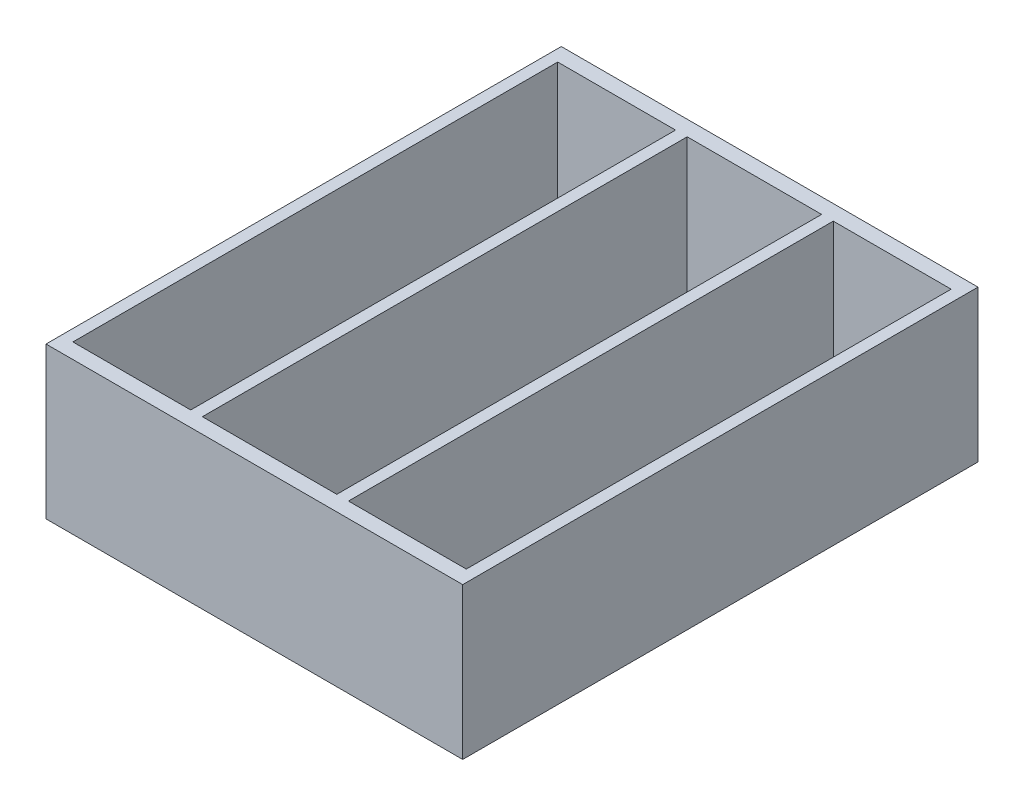
ISO-10303-21;
HEADER;
FILE_DESCRIPTION(('STEP AP214'),'2;1');
FILE_NAME('part.step','',(''),(''),'','','');
FILE_SCHEMA(('AUTOMOTIVE_DESIGN { 1 0 10303 214 1 1 1 1 }'));
ENDSEC;
DATA;
#1=APPLICATION_CONTEXT('core data for automotive mechanical design processes');
#2=APPLICATION_PROTOCOL_DEFINITION('international standard','automotive_design',2000,#1);
#3=PRODUCT_CONTEXT('',#1,'mechanical');
#4=PRODUCT('Part','Part','',(#3));
#5=PRODUCT_RELATED_PRODUCT_CATEGORY('part','',(#4));
#6=PRODUCT_DEFINITION_FORMATION('','',#4);
#7=PRODUCT_DEFINITION_CONTEXT('part definition',#1,'design');
#8=PRODUCT_DEFINITION('design','',#6,#7);
#9=PRODUCT_DEFINITION_SHAPE('','',#8);
#10=(LENGTH_UNIT() NAMED_UNIT(*) SI_UNIT(.MILLI.,.METRE.));
#11=(NAMED_UNIT(*) PLANE_ANGLE_UNIT() SI_UNIT($,.RADIAN.));
#12=(NAMED_UNIT(*) SI_UNIT($,.STERADIAN.) SOLID_ANGLE_UNIT());
#13=UNCERTAINTY_MEASURE_WITH_UNIT(LENGTH_MEASURE(1.E-05),#10,'distance_accuracy_value','');
#14=(GEOMETRIC_REPRESENTATION_CONTEXT(3) GLOBAL_UNCERTAINTY_ASSIGNED_CONTEXT((#13)) GLOBAL_UNIT_ASSIGNED_CONTEXT((#10,
#11,#12)) REPRESENTATION_CONTEXT('',''));
#15=CARTESIAN_POINT('',(0.,0.,0.));
#16=DIRECTION('',(0.,0.,1.));
#17=DIRECTION('',(1.,0.,0.));
#18=AXIS2_PLACEMENT_3D('',#15,#16,#17);
#19=CARTESIAN_POINT('',(-15.1,16.9,0.));
#20=DIRECTION('',(0.,-1.,0.));
#21=DIRECTION('',(0.,0.,-1.));
#22=AXIS2_PLACEMENT_3D('',#19,#20,#21);
#23=CYLINDRICAL_SURFACE('',#22,1.5);
#24=CARTESIAN_POINT('',(-15.1,0.,0.));
#25=DIRECTION('',(0.,-1.,0.));
#26=DIRECTION('',(0.,0.,-1.));
#27=AXIS2_PLACEMENT_3D('',#24,#25,#26);
#28=CIRCLE('',#27,1.5);
#29=CARTESIAN_POINT('',(-15.1,0.,-1.5));
#30=VERTEX_POINT('',#29);
#31=EDGE_CURVE('E290',#30,#30,#28,.T.);
#32=ORIENTED_EDGE('',*,*,#31,.T.);
#33=EDGE_LOOP('',(#32));
#34=FACE_BOUND('',#33,.T.);
#35=CARTESIAN_POINT('',(-15.1,0.799999999999999,0.));
#36=DIRECTION('',(0.,1.,0.));
#37=DIRECTION('',(0.,0.,1.));
#38=AXIS2_PLACEMENT_3D('',#35,#36,#37);
#39=CIRCLE('',#38,1.5);
#40=CARTESIAN_POINT('',(-15.1,0.799999999999999,1.5));
#41=VERTEX_POINT('',#40);
#42=EDGE_CURVE('E43',#41,#41,#39,.F.);
#43=ORIENTED_EDGE('',*,*,#42,.F.);
#44=EDGE_LOOP('',(#43));
#45=FACE_BOUND('',#44,.T.);
#46=ADVANCED_FACE('F39',(#34,#45),#23,.F.);
#47=CARTESIAN_POINT('',(15.1,16.9,0.));
#48=DIRECTION('',(0.,-1.,0.));
#49=DIRECTION('',(0.,0.,-1.));
#50=AXIS2_PLACEMENT_3D('',#47,#48,#49);
#51=CYLINDRICAL_SURFACE('',#50,1.5);
#52=CARTESIAN_POINT('',(15.1,0.,0.));
#53=DIRECTION('',(0.,-1.,0.));
#54=DIRECTION('',(0.,0.,-1.));
#55=AXIS2_PLACEMENT_3D('',#52,#53,#54);
#56=CIRCLE('',#55,1.5);
#57=CARTESIAN_POINT('',(15.1,0.,-1.5));
#58=VERTEX_POINT('',#57);
#59=EDGE_CURVE('E222',#58,#58,#56,.T.);
#60=ORIENTED_EDGE('',*,*,#59,.T.);
#61=EDGE_LOOP('',(#60));
#62=FACE_BOUND('',#61,.T.);
#63=CARTESIAN_POINT('',(15.1,0.799999999999999,0.));
#64=DIRECTION('',(0.,1.,0.));
#65=DIRECTION('',(0.,0.,1.));
#66=AXIS2_PLACEMENT_3D('',#63,#64,#65);
#67=CIRCLE('',#66,1.5);
#68=CARTESIAN_POINT('',(15.1,0.799999999999999,1.5));
#69=VERTEX_POINT('',#68);
#70=EDGE_CURVE('E284',#69,#69,#67,.F.);
#71=ORIENTED_EDGE('',*,*,#70,.F.);
#72=EDGE_LOOP('',(#71));
#73=FACE_BOUND('',#72,.T.);
#74=ADVANCED_FACE('F365',(#62,#73),#51,.F.);
#75=CARTESIAN_POINT('',(-23.25,1.6,28.75));
#76=DIRECTION('',(0.,0.,-1.));
#77=DIRECTION('',(-1.,0.,0.));
#78=AXIS2_PLACEMENT_3D('',#75,#76,#77);
#79=PLANE('',#78);
#80=DIRECTION('',(1.,0.,0.));
#81=VECTOR('',#80,1.);
#82=CARTESIAN_POINT('',(-23.25,0.,28.75));
#83=LINE('',#82,#81);
#84=CARTESIAN_POINT('',(-23.25,0.,28.75));
#85=VERTEX_POINT('',#84);
#86=CARTESIAN_POINT('',(23.25,0.,28.75));
#87=VERTEX_POINT('',#86);
#88=EDGE_CURVE('E257',#85,#87,#83,.T.);
#89=ORIENTED_EDGE('',*,*,#88,.T.);
#90=DIRECTION('',(0.,-1.,0.));
#91=VECTOR('',#90,1.);
#92=CARTESIAN_POINT('',(23.25,1.6,28.75));
#93=LINE('',#92,#91);
#94=CARTESIAN_POINT('',(23.25,16.9,28.75));
#95=VERTEX_POINT('',#94);
#96=EDGE_CURVE('E11',#95,#87,#93,.T.);
#97=ORIENTED_EDGE('',*,*,#96,.F.);
#98=DIRECTION('',(1.,0.,0.));
#99=VECTOR('',#98,1.);
#100=CARTESIAN_POINT('',(0.,16.9,28.75));
#101=LINE('',#100,#99);
#102=CARTESIAN_POINT('',(-23.25,16.9,28.75));
#103=VERTEX_POINT('',#102);
#104=EDGE_CURVE('E186',#103,#95,#101,.T.);
#105=ORIENTED_EDGE('',*,*,#104,.F.);
#106=DIRECTION('',(0.,-1.,0.));
#107=VECTOR('',#106,1.);
#108=CARTESIAN_POINT('',(-23.25,1.6,28.75));
#109=LINE('',#108,#107);
#110=EDGE_CURVE('E280',#103,#85,#109,.T.);
#111=ORIENTED_EDGE('',*,*,#110,.T.);
#112=EDGE_LOOP('',(#89,#97,#105,#111));
#113=FACE_BOUND('',#112,.T.);
#114=ADVANCED_FACE('F41',(#113),#79,.F.);
#115=CARTESIAN_POINT('',(23.25,1.6,28.75));
#116=DIRECTION('',(-1.,0.,0.));
#117=DIRECTION('',(0.,0.,1.));
#118=AXIS2_PLACEMENT_3D('',#115,#116,#117);
#119=PLANE('',#118);
#120=DIRECTION('',(0.,0.,-1.));
#121=VECTOR('',#120,1.);
#122=CARTESIAN_POINT('',(23.25,0.,28.75));
#123=LINE('',#122,#121);
#124=CARTESIAN_POINT('',(23.25,0.,-28.75));
#125=VERTEX_POINT('',#124);
#126=EDGE_CURVE('E271',#87,#125,#123,.T.);
#127=ORIENTED_EDGE('',*,*,#126,.T.);
#128=DIRECTION('',(0.,-1.,0.));
#129=VECTOR('',#128,1.);
#130=CARTESIAN_POINT('',(23.25,1.6,-28.75));
#131=LINE('',#130,#129);
#132=CARTESIAN_POINT('',(23.25,16.9,-28.75));
#133=VERTEX_POINT('',#132);
#134=EDGE_CURVE('E48',#133,#125,#131,.T.);
#135=ORIENTED_EDGE('',*,*,#134,.F.);
#136=DIRECTION('',(0.,0.,-1.));
#137=VECTOR('',#136,1.);
#138=CARTESIAN_POINT('',(23.25,16.9,0.));
#139=LINE('',#138,#137);
#140=EDGE_CURVE('E189',#95,#133,#139,.T.);
#141=ORIENTED_EDGE('',*,*,#140,.F.);
#142=ORIENTED_EDGE('',*,*,#96,.T.);
#143=EDGE_LOOP('',(#127,#135,#141,#142));
#144=FACE_BOUND('',#143,.T.);
#145=ADVANCED_FACE('F329',(#144),#119,.F.);
#146=CARTESIAN_POINT('',(-23.25,1.6,-28.75));
#147=DIRECTION('',(0.,0.,-1.));
#148=DIRECTION('',(-1.,0.,0.));
#149=AXIS2_PLACEMENT_3D('',#146,#147,#148);
#150=PLANE('',#149);
#151=DIRECTION('',(1.,0.,0.));
#152=VECTOR('',#151,1.);
#153=CARTESIAN_POINT('',(-23.25,0.,-28.75));
#154=LINE('',#153,#152);
#155=CARTESIAN_POINT('',(-23.25,0.,-28.75));
#156=VERTEX_POINT('',#155);
#157=EDGE_CURVE('E274',#156,#125,#154,.T.);
#158=ORIENTED_EDGE('',*,*,#157,.F.);
#159=DIRECTION('',(0.,-1.,0.));
#160=VECTOR('',#159,1.);
#161=CARTESIAN_POINT('',(-23.25,1.6,-28.75));
#162=LINE('',#161,#160);
#163=CARTESIAN_POINT('',(-23.25,16.9,-28.75));
#164=VERTEX_POINT('',#163);
#165=EDGE_CURVE('E282',#164,#156,#162,.T.);
#166=ORIENTED_EDGE('',*,*,#165,.F.);
#167=DIRECTION('',(-1.,0.,0.));
#168=VECTOR('',#167,1.);
#169=CARTESIAN_POINT('',(0.,16.9,-28.75));
#170=LINE('',#169,#168);
#171=EDGE_CURVE('E192',#133,#164,#170,.T.);
#172=ORIENTED_EDGE('',*,*,#171,.F.);
#173=ORIENTED_EDGE('',*,*,#134,.T.);
#174=EDGE_LOOP('',(#158,#166,#172,#173));
#175=FACE_BOUND('',#174,.T.);
#176=ADVANCED_FACE('F326',(#175),#150,.T.);
#177=CARTESIAN_POINT('',(-23.25,1.6,28.75));
#178=DIRECTION('',(-1.,0.,0.));
#179=DIRECTION('',(0.,0.,1.));
#180=AXIS2_PLACEMENT_3D('',#177,#178,#179);
#181=PLANE('',#180);
#182=DIRECTION('',(0.,0.,-1.));
#183=VECTOR('',#182,1.);
#184=CARTESIAN_POINT('',(-23.25,0.,28.75));
#185=LINE('',#184,#183);
#186=EDGE_CURVE('E277',#85,#156,#185,.T.);
#187=ORIENTED_EDGE('',*,*,#186,.F.);
#188=ORIENTED_EDGE('',*,*,#110,.F.);
#189=DIRECTION('',(0.,0.,1.));
#190=VECTOR('',#189,1.);
#191=CARTESIAN_POINT('',(-23.25,16.9,0.));
#192=LINE('',#191,#190);
#193=EDGE_CURVE('E195',#164,#103,#192,.T.);
#194=ORIENTED_EDGE('',*,*,#193,.F.);
#195=ORIENTED_EDGE('',*,*,#165,.T.);
#196=EDGE_LOOP('',(#187,#188,#194,#195));
#197=FACE_BOUND('',#196,.T.);
#198=ADVANCED_FACE('F315',(#197),#181,.T.);
#199=CARTESIAN_POINT('',(0.,0.,0.));
#200=DIRECTION('',(0.,1.,0.));
#201=DIRECTION('',(0.,0.,1.));
#202=AXIS2_PLACEMENT_3D('',#199,#200,#201);
#203=PLANE('',#202);
#204=ORIENTED_EDGE('',*,*,#59,.F.);
#205=EDGE_LOOP('',(#204));
#206=FACE_BOUND('',#205,.T.);
#207=ORIENTED_EDGE('',*,*,#31,.F.);
#208=EDGE_LOOP('',(#207));
#209=FACE_BOUND('',#208,.T.);
#210=ORIENTED_EDGE('',*,*,#88,.F.);
#211=ORIENTED_EDGE('',*,*,#186,.T.);
#212=ORIENTED_EDGE('',*,*,#157,.T.);
#213=ORIENTED_EDGE('',*,*,#126,.F.);
#214=EDGE_LOOP('',(#210,#211,#212,#213));
#215=FACE_BOUND('',#214,.T.);
#216=ADVANCED_FACE('F311',(#206,#209,#215),#203,.F.);
#217=CARTESIAN_POINT('',(0.,16.9,27.05));
#218=DIRECTION('',(0.,0.,-1.));
#219=DIRECTION('',(-1.,0.,0.));
#220=AXIS2_PLACEMENT_3D('',#217,#218,#219);
#221=PLANE('',#220);
#222=DIRECTION('',(1.,0.,0.));
#223=VECTOR('',#222,1.);
#224=CARTESIAN_POINT('',(0.,1.6,27.05));
#225=LINE('',#224,#223);
#226=CARTESIAN_POINT('',(-21.95,1.6,27.05));
#227=VERTEX_POINT('',#226);
#228=CARTESIAN_POINT('',(-8.8,1.6,27.05));
#229=VERTEX_POINT('',#228);
#230=EDGE_CURVE('E237',#227,#229,#225,.T.);
#231=ORIENTED_EDGE('',*,*,#230,.F.);
#232=DIRECTION('',(0.,-1.,0.));
#233=VECTOR('',#232,1.);
#234=CARTESIAN_POINT('',(-21.95,16.9,27.05));
#235=LINE('',#234,#233);
#236=CARTESIAN_POINT('',(-21.95,16.9,27.05));
#237=VERTEX_POINT('',#236);
#238=EDGE_CURVE('E255',#237,#227,#235,.T.);
#239=ORIENTED_EDGE('',*,*,#238,.F.);
#240=DIRECTION('',(1.,0.,0.));
#241=VECTOR('',#240,1.);
#242=CARTESIAN_POINT('',(0.,16.9,27.05));
#243=LINE('',#242,#241);
#244=CARTESIAN_POINT('',(-8.8,16.9,27.05));
#245=VERTEX_POINT('',#244);
#246=EDGE_CURVE('E208',#237,#245,#243,.T.);
#247=ORIENTED_EDGE('',*,*,#246,.T.);
#248=DIRECTION('',(0.,-1.,0.));
#249=VECTOR('',#248,1.);
#250=CARTESIAN_POINT('',(-8.8,16.9,27.05));
#251=LINE('',#250,#249);
#252=EDGE_CURVE('E247',#245,#229,#251,.T.);
#253=ORIENTED_EDGE('',*,*,#252,.T.);
#254=EDGE_LOOP('',(#231,#239,#247,#253));
#255=FACE_BOUND('',#254,.T.);
#256=ADVANCED_FACE('F314',(#255),#221,.T.);
#257=CARTESIAN_POINT('',(-21.95,16.9,0.));
#258=DIRECTION('',(1.,0.,0.));
#259=DIRECTION('',(0.,0.,-1.));
#260=AXIS2_PLACEMENT_3D('',#257,#258,#259);
#261=PLANE('',#260);
#262=DIRECTION('',(0.,0.,1.));
#263=VECTOR('',#262,1.);
#264=CARTESIAN_POINT('',(-21.95,1.6,0.));
#265=LINE('',#264,#263);
#266=CARTESIAN_POINT('',(-21.95,1.6,-27.05));
#267=VERTEX_POINT('',#266);
#268=EDGE_CURVE('E240',#267,#227,#265,.T.);
#269=ORIENTED_EDGE('',*,*,#268,.F.);
#270=DIRECTION('',(0.,-1.,0.));
#271=VECTOR('',#270,1.);
#272=CARTESIAN_POINT('',(-21.95,16.9,-27.05));
#273=LINE('',#272,#271);
#274=CARTESIAN_POINT('',(-21.95,16.9,-27.05));
#275=VERTEX_POINT('',#274);
#276=EDGE_CURVE('E253',#275,#267,#273,.T.);
#277=ORIENTED_EDGE('',*,*,#276,.F.);
#278=DIRECTION('',(0.,0.,1.));
#279=VECTOR('',#278,1.);
#280=CARTESIAN_POINT('',(-21.95,16.9,0.));
#281=LINE('',#280,#279);
#282=EDGE_CURVE('E211',#275,#237,#281,.T.);
#283=ORIENTED_EDGE('',*,*,#282,.T.);
#284=ORIENTED_EDGE('',*,*,#238,.T.);
#285=EDGE_LOOP('',(#269,#277,#283,#284));
#286=FACE_BOUND('',#285,.T.);
#287=ADVANCED_FACE('F346',(#286),#261,.T.);
#288=CARTESIAN_POINT('',(0.,16.9,-27.05));
#289=DIRECTION('',(0.,0.,-1.));
#290=DIRECTION('',(-1.,0.,0.));
#291=AXIS2_PLACEMENT_3D('',#288,#289,#290);
#292=PLANE('',#291);
#293=DIRECTION('',(1.,0.,0.));
#294=VECTOR('',#293,1.);
#295=CARTESIAN_POINT('',(0.,1.6,-27.05));
#296=LINE('',#295,#294);
#297=CARTESIAN_POINT('',(-8.8,1.6,-27.05));
#298=VERTEX_POINT('',#297);
#299=EDGE_CURVE('E243',#267,#298,#296,.T.);
#300=ORIENTED_EDGE('',*,*,#299,.T.);
#301=DIRECTION('',(0.,-1.,0.));
#302=VECTOR('',#301,1.);
#303=CARTESIAN_POINT('',(-8.8,16.9,-27.05));
#304=LINE('',#303,#302);
#305=CARTESIAN_POINT('',(-8.8,16.9,-27.05));
#306=VERTEX_POINT('',#305);
#307=EDGE_CURVE('E249',#306,#298,#304,.T.);
#308=ORIENTED_EDGE('',*,*,#307,.F.);
#309=DIRECTION('',(1.,0.,0.));
#310=VECTOR('',#309,1.);
#311=CARTESIAN_POINT('',(0.,16.9,-27.05));
#312=LINE('',#311,#310);
#313=EDGE_CURVE('E214',#275,#306,#312,.T.);
#314=ORIENTED_EDGE('',*,*,#313,.F.);
#315=ORIENTED_EDGE('',*,*,#276,.T.);
#316=EDGE_LOOP('',(#300,#308,#314,#315));
#317=FACE_BOUND('',#316,.T.);
#318=ADVANCED_FACE('F352',(#317),#292,.F.);
#319=CARTESIAN_POINT('',(7.5,16.9,0.));
#320=DIRECTION('',(1.,0.,0.));
#321=DIRECTION('',(0.,0.,-1.));
#322=AXIS2_PLACEMENT_3D('',#319,#320,#321);
#323=PLANE('',#322);
#324=DIRECTION('',(0.,0.,1.));
#325=VECTOR('',#324,1.);
#326=CARTESIAN_POINT('',(7.5,1.6,0.));
#327=LINE('',#326,#325);
#328=CARTESIAN_POINT('',(7.5,1.6,-27.05));
#329=VERTEX_POINT('',#328);
#330=CARTESIAN_POINT('',(7.5,1.6,27.05));
#331=VERTEX_POINT('',#330);
#332=EDGE_CURVE('E228',#329,#331,#327,.T.);
#333=ORIENTED_EDGE('',*,*,#332,.T.);
#334=DIRECTION('',(0.,-1.,0.));
#335=VECTOR('',#334,1.);
#336=CARTESIAN_POINT('',(7.5,16.9,27.05));
#337=LINE('',#336,#335);
#338=CARTESIAN_POINT('',(7.5,16.9,27.05));
#339=VERTEX_POINT('',#338);
#340=EDGE_CURVE('E250',#339,#331,#337,.T.);
#341=ORIENTED_EDGE('',*,*,#340,.F.);
#342=DIRECTION('',(0.,0.,1.));
#343=VECTOR('',#342,1.);
#344=CARTESIAN_POINT('',(7.5,16.9,0.));
#345=LINE('',#344,#343);
#346=CARTESIAN_POINT('',(7.5,16.9,-27.05));
#347=VERTEX_POINT('',#346);
#348=EDGE_CURVE('E198',#347,#339,#345,.T.);
#349=ORIENTED_EDGE('',*,*,#348,.F.);
#350=DIRECTION('',(0.,-1.,0.));
#351=VECTOR('',#350,1.);
#352=CARTESIAN_POINT('',(7.5,16.9,-27.05));
#353=LINE('',#352,#351);
#354=EDGE_CURVE('E164',#347,#329,#353,.T.);
#355=ORIENTED_EDGE('',*,*,#354,.T.);
#356=EDGE_LOOP('',(#333,#341,#349,#355));
#357=FACE_BOUND('',#356,.T.);
#358=ADVANCED_FACE('F378',(#357),#323,.F.);
#359=CARTESIAN_POINT('',(0.,16.9,27.05));
#360=DIRECTION('',(0.,0.,-1.));
#361=DIRECTION('',(-1.,0.,0.));
#362=AXIS2_PLACEMENT_3D('',#359,#360,#361);
#363=PLANE('',#362);
#364=DIRECTION('',(1.,0.,0.));
#365=VECTOR('',#364,1.);
#366=CARTESIAN_POINT('',(0.,1.6,27.05));
#367=LINE('',#366,#365);
#368=CARTESIAN_POINT('',(-7.49999999999999,1.6,27.05));
#369=VERTEX_POINT('',#368);
#370=EDGE_CURVE('E231',#369,#331,#367,.T.);
#371=ORIENTED_EDGE('',*,*,#370,.F.);
#372=DIRECTION('',(0.,-1.,0.));
#373=VECTOR('',#372,1.);
#374=CARTESIAN_POINT('',(-7.49999999999999,16.9,27.05));
#375=LINE('',#374,#373);
#376=CARTESIAN_POINT('',(-7.49999999999999,16.9,27.05));
#377=VERTEX_POINT('',#376);
#378=EDGE_CURVE('E262',#377,#369,#375,.T.);
#379=ORIENTED_EDGE('',*,*,#378,.F.);
#380=DIRECTION('',(1.,0.,0.));
#381=VECTOR('',#380,1.);
#382=CARTESIAN_POINT('',(0.,16.9,27.05));
#383=LINE('',#382,#381);
#384=EDGE_CURVE('E200',#377,#339,#383,.T.);
#385=ORIENTED_EDGE('',*,*,#384,.T.);
#386=ORIENTED_EDGE('',*,*,#340,.T.);
#387=EDGE_LOOP('',(#371,#379,#385,#386));
#388=FACE_BOUND('',#387,.T.);
#389=ADVANCED_FACE('F382',(#388),#363,.T.);
#390=CARTESIAN_POINT('',(-7.5,16.9,0.));
#391=DIRECTION('',(1.,0.,0.));
#392=DIRECTION('',(0.,0.,-1.));
#393=AXIS2_PLACEMENT_3D('',#390,#391,#392);
#394=PLANE('',#393);
#395=DIRECTION('',(0.,0.,1.));
#396=VECTOR('',#395,1.);
#397=CARTESIAN_POINT('',(-7.5,1.6,0.));
#398=LINE('',#397,#396);
#399=CARTESIAN_POINT('',(-7.5,1.6,-27.05));
#400=VERTEX_POINT('',#399);
#401=EDGE_CURVE('E56',#400,#369,#398,.T.);
#402=ORIENTED_EDGE('',*,*,#401,.F.);
#403=DIRECTION('',(0.,-1.,0.));
#404=VECTOR('',#403,1.);
#405=CARTESIAN_POINT('',(-7.5,16.9,-27.05));
#406=LINE('',#405,#404);
#407=CARTESIAN_POINT('',(-7.5,16.9,-27.05));
#408=VERTEX_POINT('',#407);
#409=EDGE_CURVE('E260',#408,#400,#406,.T.);
#410=ORIENTED_EDGE('',*,*,#409,.F.);
#411=DIRECTION('',(0.,0.,1.));
#412=VECTOR('',#411,1.);
#413=CARTESIAN_POINT('',(-7.5,16.9,0.));
#414=LINE('',#413,#412);
#415=EDGE_CURVE('E203',#408,#377,#414,.T.);
#416=ORIENTED_EDGE('',*,*,#415,.T.);
#417=ORIENTED_EDGE('',*,*,#378,.T.);
#418=EDGE_LOOP('',(#402,#410,#416,#417));
#419=FACE_BOUND('',#418,.T.);
#420=ADVANCED_FACE('F388',(#419),#394,.T.);
#421=CARTESIAN_POINT('',(21.95,16.9,0.));
#422=DIRECTION('',(-1.,0.,0.));
#423=DIRECTION('',(0.,0.,1.));
#424=AXIS2_PLACEMENT_3D('',#421,#422,#423);
#425=PLANE('',#424);
#426=DIRECTION('',(0.,0.,-1.));
#427=VECTOR('',#426,1.);
#428=CARTESIAN_POINT('',(21.95,1.6,0.));
#429=LINE('',#428,#427);
#430=CARTESIAN_POINT('',(21.95,1.6,27.05));
#431=VERTEX_POINT('',#430);
#432=CARTESIAN_POINT('',(21.95,1.6,-27.05));
#433=VERTEX_POINT('',#432);
#434=EDGE_CURVE('E159',#431,#433,#429,.T.);
#435=ORIENTED_EDGE('',*,*,#434,.F.);
#436=DIRECTION('',(0.,-1.,0.));
#437=VECTOR('',#436,1.);
#438=CARTESIAN_POINT('',(21.95,16.9,27.05));
#439=LINE('',#438,#437);
#440=CARTESIAN_POINT('',(21.95,16.9,27.05));
#441=VERTEX_POINT('',#440);
#442=EDGE_CURVE('E154',#441,#431,#439,.T.);
#443=ORIENTED_EDGE('',*,*,#442,.F.);
#444=DIRECTION('',(0.,0.,-1.));
#445=VECTOR('',#444,1.);
#446=CARTESIAN_POINT('',(21.95,16.9,0.));
#447=LINE('',#446,#445);
#448=CARTESIAN_POINT('',(21.95,16.9,-27.05));
#449=VERTEX_POINT('',#448);
#450=EDGE_CURVE('E157',#441,#449,#447,.T.);
#451=ORIENTED_EDGE('',*,*,#450,.T.);
#452=DIRECTION('',(0.,-1.,0.));
#453=VECTOR('',#452,1.);
#454=CARTESIAN_POINT('',(21.95,16.9,-27.05));
#455=LINE('',#454,#453);
#456=EDGE_CURVE('E219',#449,#433,#455,.T.);
#457=ORIENTED_EDGE('',*,*,#456,.T.);
#458=EDGE_LOOP('',(#435,#443,#451,#457));
#459=FACE_BOUND('',#458,.T.);
#460=ADVANCED_FACE('F156',(#459),#425,.T.);
#461=CARTESIAN_POINT('',(0.,16.9,27.05));
#462=DIRECTION('',(0.,0.,-1.));
#463=DIRECTION('',(-1.,0.,0.));
#464=AXIS2_PLACEMENT_3D('',#461,#462,#463);
#465=PLANE('',#464);
#466=DIRECTION('',(1.,0.,0.));
#467=VECTOR('',#466,1.);
#468=CARTESIAN_POINT('',(0.,1.6,27.05));
#469=LINE('',#468,#467);
#470=CARTESIAN_POINT('',(8.8,1.6,27.05));
#471=VERTEX_POINT('',#470);
#472=EDGE_CURVE('E221',#471,#431,#469,.T.);
#473=ORIENTED_EDGE('',*,*,#472,.F.);
#474=DIRECTION('',(0.,-1.,0.));
#475=VECTOR('',#474,1.);
#476=CARTESIAN_POINT('',(8.8,16.9,27.05));
#477=LINE('',#476,#475);
#478=CARTESIAN_POINT('',(8.8,16.9,27.05));
#479=VERTEX_POINT('',#478);
#480=EDGE_CURVE('E165',#479,#471,#477,.T.);
#481=ORIENTED_EDGE('',*,*,#480,.F.);
#482=DIRECTION('',(1.,0.,0.));
#483=VECTOR('',#482,1.);
#484=CARTESIAN_POINT('',(0.,16.9,27.05));
#485=LINE('',#484,#483);
#486=EDGE_CURVE('E172',#479,#441,#485,.T.);
#487=ORIENTED_EDGE('',*,*,#486,.T.);
#488=ORIENTED_EDGE('',*,*,#442,.T.);
#489=EDGE_LOOP('',(#473,#481,#487,#488));
#490=FACE_BOUND('',#489,.T.);
#491=ADVANCED_FACE('F179',(#490),#465,.T.);
#492=CARTESIAN_POINT('',(8.8,16.9,0.));
#493=DIRECTION('',(1.,0.,0.));
#494=DIRECTION('',(0.,0.,-1.));
#495=AXIS2_PLACEMENT_3D('',#492,#493,#494);
#496=PLANE('',#495);
#497=DIRECTION('',(0.,0.,1.));
#498=VECTOR('',#497,1.);
#499=CARTESIAN_POINT('',(8.8,1.6,0.));
#500=LINE('',#499,#498);
#501=CARTESIAN_POINT('',(8.8,1.6,-27.05));
#502=VERTEX_POINT('',#501);
#503=EDGE_CURVE('E64',#502,#471,#500,.T.);
#504=ORIENTED_EDGE('',*,*,#503,.F.);
#505=DIRECTION('',(0.,-1.,0.));
#506=VECTOR('',#505,1.);
#507=CARTESIAN_POINT('',(8.8,16.9,-27.05));
#508=LINE('',#507,#506);
#509=CARTESIAN_POINT('',(8.8,16.9,-27.05));
#510=VERTEX_POINT('',#509);
#511=EDGE_CURVE('E266',#510,#502,#508,.T.);
#512=ORIENTED_EDGE('',*,*,#511,.F.);
#513=DIRECTION('',(0.,0.,1.));
#514=VECTOR('',#513,1.);
#515=CARTESIAN_POINT('',(8.8,16.9,0.));
#516=LINE('',#515,#514);
#517=EDGE_CURVE('E180',#510,#479,#516,.T.);
#518=ORIENTED_EDGE('',*,*,#517,.T.);
#519=ORIENTED_EDGE('',*,*,#480,.T.);
#520=EDGE_LOOP('',(#504,#512,#518,#519));
#521=FACE_BOUND('',#520,.T.);
#522=ADVANCED_FACE('F397',(#521),#496,.T.);
#523=CARTESIAN_POINT('',(0.,16.9,-27.05));
#524=DIRECTION('',(0.,0.,-1.));
#525=DIRECTION('',(-1.,0.,0.));
#526=AXIS2_PLACEMENT_3D('',#523,#524,#525);
#527=PLANE('',#526);
#528=DIRECTION('',(1.,0.,0.));
#529=VECTOR('',#528,1.);
#530=CARTESIAN_POINT('',(0.,1.6,-27.05));
#531=LINE('',#530,#529);
#532=EDGE_CURVE('E235',#400,#329,#531,.T.);
#533=ORIENTED_EDGE('',*,*,#532,.T.);
#534=ORIENTED_EDGE('',*,*,#354,.F.);
#535=DIRECTION('',(1.,0.,0.));
#536=VECTOR('',#535,1.);
#537=CARTESIAN_POINT('',(0.,16.9,-27.05));
#538=LINE('',#537,#536);
#539=EDGE_CURVE('E206',#408,#347,#538,.T.);
#540=ORIENTED_EDGE('',*,*,#539,.F.);
#541=ORIENTED_EDGE('',*,*,#409,.T.);
#542=EDGE_LOOP('',(#533,#534,#540,#541));
#543=FACE_BOUND('',#542,.T.);
#544=ADVANCED_FACE('F395',(#543),#527,.F.);
#545=CARTESIAN_POINT('',(0.,16.9,-27.05));
#546=DIRECTION('',(0.,0.,-1.));
#547=DIRECTION('',(-1.,0.,0.));
#548=AXIS2_PLACEMENT_3D('',#545,#546,#547);
#549=PLANE('',#548);
#550=DIRECTION('',(1.,0.,0.));
#551=VECTOR('',#550,1.);
#552=CARTESIAN_POINT('',(0.,1.6,-27.05));
#553=LINE('',#552,#551);
#554=EDGE_CURVE('E225',#502,#433,#553,.T.);
#555=ORIENTED_EDGE('',*,*,#554,.T.);
#556=ORIENTED_EDGE('',*,*,#456,.F.);
#557=DIRECTION('',(1.,0.,0.));
#558=VECTOR('',#557,1.);
#559=CARTESIAN_POINT('',(0.,16.9,-27.05));
#560=LINE('',#559,#558);
#561=EDGE_CURVE('E175',#510,#449,#560,.T.);
#562=ORIENTED_EDGE('',*,*,#561,.F.);
#563=ORIENTED_EDGE('',*,*,#511,.T.);
#564=EDGE_LOOP('',(#555,#556,#562,#563));
#565=FACE_BOUND('',#564,.T.);
#566=ADVANCED_FACE('F376',(#565),#549,.F.);
#567=CARTESIAN_POINT('',(-8.8,16.9,0.));
#568=DIRECTION('',(1.,0.,0.));
#569=DIRECTION('',(0.,0.,-1.));
#570=AXIS2_PLACEMENT_3D('',#567,#568,#569);
#571=PLANE('',#570);
#572=DIRECTION('',(0.,0.,1.));
#573=VECTOR('',#572,1.);
#574=CARTESIAN_POINT('',(-8.8,1.6,0.));
#575=LINE('',#574,#573);
#576=EDGE_CURVE('E177',#298,#229,#575,.T.);
#577=ORIENTED_EDGE('',*,*,#576,.T.);
#578=ORIENTED_EDGE('',*,*,#252,.F.);
#579=DIRECTION('',(0.,0.,1.));
#580=VECTOR('',#579,1.);
#581=CARTESIAN_POINT('',(-8.8,16.9,0.));
#582=LINE('',#581,#580);
#583=EDGE_CURVE('E217',#306,#245,#582,.T.);
#584=ORIENTED_EDGE('',*,*,#583,.F.);
#585=ORIENTED_EDGE('',*,*,#307,.T.);
#586=EDGE_LOOP('',(#577,#578,#584,#585));
#587=FACE_BOUND('',#586,.T.);
#588=ADVANCED_FACE('F334',(#587),#571,.F.);
#589=CARTESIAN_POINT('',(0.,16.9,0.));
#590=DIRECTION('',(0.,1.,0.));
#591=DIRECTION('',(0.,0.,1.));
#592=AXIS2_PLACEMENT_3D('',#589,#590,#591);
#593=PLANE('',#592);
#594=ORIENTED_EDGE('',*,*,#450,.F.);
#595=ORIENTED_EDGE('',*,*,#486,.F.);
#596=ORIENTED_EDGE('',*,*,#517,.F.);
#597=ORIENTED_EDGE('',*,*,#561,.T.);
#598=EDGE_LOOP('',(#594,#595,#596,#597));
#599=FACE_BOUND('',#598,.T.);
#600=ORIENTED_EDGE('',*,*,#104,.T.);
#601=ORIENTED_EDGE('',*,*,#140,.T.);
#602=ORIENTED_EDGE('',*,*,#171,.T.);
#603=ORIENTED_EDGE('',*,*,#193,.T.);
#604=EDGE_LOOP('',(#600,#601,#602,#603));
#605=FACE_BOUND('',#604,.T.);
#606=ORIENTED_EDGE('',*,*,#348,.T.);
#607=ORIENTED_EDGE('',*,*,#384,.F.);
#608=ORIENTED_EDGE('',*,*,#415,.F.);
#609=ORIENTED_EDGE('',*,*,#539,.T.);
#610=EDGE_LOOP('',(#606,#607,#608,#609));
#611=FACE_BOUND('',#610,.T.);
#612=ORIENTED_EDGE('',*,*,#246,.F.);
#613=ORIENTED_EDGE('',*,*,#282,.F.);
#614=ORIENTED_EDGE('',*,*,#313,.T.);
#615=ORIENTED_EDGE('',*,*,#583,.T.);
#616=EDGE_LOOP('',(#612,#613,#614,#615));
#617=FACE_BOUND('',#616,.T.);
#618=ADVANCED_FACE('F169',(#599,#605,#611,#617),#593,.T.);
#619=CARTESIAN_POINT('',(0.,1.6,0.));
#620=DIRECTION('',(0.,1.,0.));
#621=DIRECTION('',(0.,0.,1.));
#622=AXIS2_PLACEMENT_3D('',#619,#620,#621);
#623=PLANE('',#622);
#624=CARTESIAN_POINT('',(15.1,1.6,0.));
#625=DIRECTION('',(0.,1.,0.));
#626=DIRECTION('',(0.,0.,1.));
#627=AXIS2_PLACEMENT_3D('',#624,#625,#626);
#628=CIRCLE('',#627,2.5);
#629=CARTESIAN_POINT('',(15.1,1.6,2.5));
#630=VERTEX_POINT('',#629);
#631=EDGE_CURVE('E297',#630,#630,#628,.T.);
#632=ORIENTED_EDGE('',*,*,#631,.F.);
#633=EDGE_LOOP('',(#632));
#634=FACE_BOUND('',#633,.T.);
#635=ORIENTED_EDGE('',*,*,#434,.T.);
#636=ORIENTED_EDGE('',*,*,#554,.F.);
#637=ORIENTED_EDGE('',*,*,#503,.T.);
#638=ORIENTED_EDGE('',*,*,#472,.T.);
#639=EDGE_LOOP('',(#635,#636,#637,#638));
#640=FACE_BOUND('',#639,.T.);
#641=ADVANCED_FACE('F333',(#634,#640),#623,.T.);
#642=ORIENTED_EDGE('',*,*,#370,.T.);
#643=ORIENTED_EDGE('',*,*,#332,.F.);
#644=ORIENTED_EDGE('',*,*,#532,.F.);
#645=ORIENTED_EDGE('',*,*,#401,.T.);
#646=EDGE_LOOP('',(#642,#643,#644,#645));
#647=FACE_BOUND('',#646,.T.);
#648=ADVANCED_FACE('F406',(#647),#623,.T.);
#649=CARTESIAN_POINT('',(-15.1,1.6,0.));
#650=DIRECTION('',(0.,1.,0.));
#651=DIRECTION('',(0.,0.,1.));
#652=AXIS2_PLACEMENT_3D('',#649,#650,#651);
#653=CIRCLE('',#652,2.5);
#654=CARTESIAN_POINT('',(-15.1,1.6,2.5));
#655=VERTEX_POINT('',#654);
#656=EDGE_CURVE('E292',#655,#655,#653,.T.);
#657=ORIENTED_EDGE('',*,*,#656,.F.);
#658=EDGE_LOOP('',(#657));
#659=FACE_BOUND('',#658,.T.);
#660=ORIENTED_EDGE('',*,*,#230,.T.);
#661=ORIENTED_EDGE('',*,*,#576,.F.);
#662=ORIENTED_EDGE('',*,*,#299,.F.);
#663=ORIENTED_EDGE('',*,*,#268,.T.);
#664=EDGE_LOOP('',(#660,#661,#662,#663));
#665=FACE_BOUND('',#664,.T.);
#666=ADVANCED_FACE('F356',(#659,#665),#623,.T.);
#667=CARTESIAN_POINT('',(15.1,0.8,0.));
#668=DIRECTION('',(0.,1.,0.));
#669=DIRECTION('',(0.,0.,1.));
#670=AXIS2_PLACEMENT_3D('',#667,#668,#669);
#671=PLANE('',#670);
#672=CARTESIAN_POINT('',(15.1,0.8,0.));
#673=DIRECTION('',(0.,1.,0.));
#674=DIRECTION('',(0.,0.,1.));
#675=AXIS2_PLACEMENT_3D('',#672,#673,#674);
#676=CIRCLE('',#675,2.5);
#677=CARTESIAN_POINT('',(15.1,0.8,2.5));
#678=VERTEX_POINT('',#677);
#679=EDGE_CURVE('E302',#678,#678,#676,.T.);
#680=ORIENTED_EDGE('',*,*,#679,.T.);
#681=EDGE_LOOP('',(#680));
#682=FACE_BOUND('',#681,.T.);
#683=ORIENTED_EDGE('',*,*,#70,.T.);
#684=EDGE_LOOP('',(#683));
#685=FACE_BOUND('',#684,.T.);
#686=ADVANCED_FACE('F405',(#682,#685),#671,.T.);
#687=CARTESIAN_POINT('',(15.1,0.8,0.));
#688=DIRECTION('',(0.,1.,0.));
#689=DIRECTION('',(0.,0.,1.));
#690=AXIS2_PLACEMENT_3D('',#687,#688,#689);
#691=CYLINDRICAL_SURFACE('',#690,2.5);
#692=ORIENTED_EDGE('',*,*,#679,.F.);
#693=EDGE_LOOP('',(#692));
#694=FACE_BOUND('',#693,.T.);
#695=ORIENTED_EDGE('',*,*,#631,.T.);
#696=EDGE_LOOP('',(#695));
#697=FACE_BOUND('',#696,.T.);
#698=ADVANCED_FACE('F455',(#694,#697),#691,.F.);
#699=CARTESIAN_POINT('',(-15.1,0.8,0.));
#700=DIRECTION('',(0.,1.,0.));
#701=DIRECTION('',(0.,0.,1.));
#702=AXIS2_PLACEMENT_3D('',#699,#700,#701);
#703=PLANE('',#702);
#704=CARTESIAN_POINT('',(-15.1,0.8,0.));
#705=DIRECTION('',(0.,1.,0.));
#706=DIRECTION('',(0.,0.,1.));
#707=AXIS2_PLACEMENT_3D('',#704,#705,#706);
#708=CIRCLE('',#707,2.5);
#709=CARTESIAN_POINT('',(-15.1,0.8,2.5));
#710=VERTEX_POINT('',#709);
#711=EDGE_CURVE('E286',#710,#710,#708,.T.);
#712=ORIENTED_EDGE('',*,*,#711,.T.);
#713=EDGE_LOOP('',(#712));
#714=FACE_BOUND('',#713,.T.);
#715=ORIENTED_EDGE('',*,*,#42,.T.);
#716=EDGE_LOOP('',(#715));
#717=FACE_BOUND('',#716,.T.);
#718=ADVANCED_FACE('F466',(#714,#717),#703,.T.);
#719=CARTESIAN_POINT('',(-15.1,0.8,0.));
#720=DIRECTION('',(0.,1.,0.));
#721=DIRECTION('',(0.,0.,1.));
#722=AXIS2_PLACEMENT_3D('',#719,#720,#721);
#723=CYLINDRICAL_SURFACE('',#722,2.5);
#724=ORIENTED_EDGE('',*,*,#711,.F.);
#725=EDGE_LOOP('',(#724));
#726=FACE_BOUND('',#725,.T.);
#727=ORIENTED_EDGE('',*,*,#656,.T.);
#728=EDGE_LOOP('',(#727));
#729=FACE_BOUND('',#728,.T.);
#730=ADVANCED_FACE('F477',(#726,#729),#723,.F.);
#731=CLOSED_SHELL('',(#46,#74,#114,#145,#176,#198,#216,#256,#287,#318,#358,#389,#420,#460,#491,
#522,#544,#566,#588,#618,#641,#648,#666,#686,#698,#718,#730));
#732=MANIFOLD_SOLID_BREP('B2',#731);
#733=ADVANCED_BREP_SHAPE_REPRESENTATION('',(#18,#732),#14);
#734=SHAPE_DEFINITION_REPRESENTATION(#9,#733);
ENDSEC;
END-ISO-10303-21;
